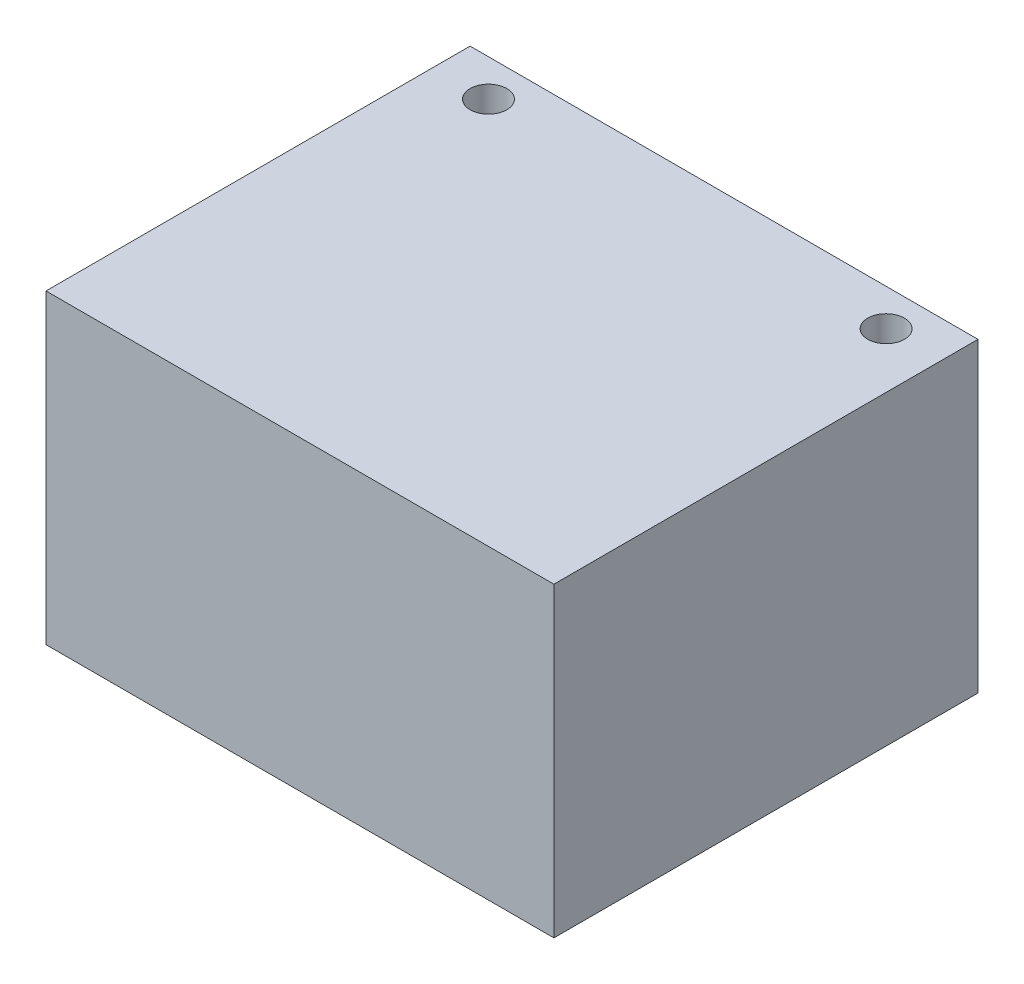
ISO-10303-21;
HEADER;
FILE_DESCRIPTION(('STEP AP214'),'2;1');
FILE_NAME('part.step','',(''),(''),'','','');
FILE_SCHEMA(('AUTOMOTIVE_DESIGN { 1 0 10303 214 1 1 1 1 }'));
ENDSEC;
DATA;
#1=APPLICATION_CONTEXT('core data for automotive mechanical design processes');
#2=APPLICATION_PROTOCOL_DEFINITION('international standard','automotive_design',2000,#1);
#3=PRODUCT_CONTEXT('',#1,'mechanical');
#4=PRODUCT('Part','Part','',(#3));
#5=PRODUCT_RELATED_PRODUCT_CATEGORY('part','',(#4));
#6=PRODUCT_DEFINITION_FORMATION('','',#4);
#7=PRODUCT_DEFINITION_CONTEXT('part definition',#1,'design');
#8=PRODUCT_DEFINITION('design','',#6,#7);
#9=PRODUCT_DEFINITION_SHAPE('','',#8);
#10=(LENGTH_UNIT() NAMED_UNIT(*) SI_UNIT(.MILLI.,.METRE.));
#11=(NAMED_UNIT(*) PLANE_ANGLE_UNIT() SI_UNIT($,.RADIAN.));
#12=(NAMED_UNIT(*) SI_UNIT($,.STERADIAN.) SOLID_ANGLE_UNIT());
#13=UNCERTAINTY_MEASURE_WITH_UNIT(LENGTH_MEASURE(1.E-05),#10,'distance_accuracy_value','');
#14=(GEOMETRIC_REPRESENTATION_CONTEXT(3) GLOBAL_UNCERTAINTY_ASSIGNED_CONTEXT((#13)) GLOBAL_UNIT_ASSIGNED_CONTEXT((#10,
#11,#12)) REPRESENTATION_CONTEXT('',''));
#15=CARTESIAN_POINT('',(0.,0.,0.));
#16=DIRECTION('',(0.,0.,1.));
#17=DIRECTION('',(1.,0.,0.));
#18=AXIS2_PLACEMENT_3D('',#15,#16,#17);
#19=CARTESIAN_POINT('',(20.725,25.,17.305));
#20=DIRECTION('',(-1.,0.,0.));
#21=DIRECTION('',(0.,0.,1.));
#22=AXIS2_PLACEMENT_3D('',#19,#20,#21);
#23=PLANE('',#22);
#24=DIRECTION('',(0.,0.,-1.));
#25=VECTOR('',#24,1.);
#26=CARTESIAN_POINT('',(20.725,0.,17.305));
#27=LINE('',#26,#25);
#28=CARTESIAN_POINT('',(20.725,0.,17.305));
#29=VERTEX_POINT('',#28);
#30=CARTESIAN_POINT('',(20.725,0.,-17.305));
#31=VERTEX_POINT('',#30);
#32=EDGE_CURVE('E113',#29,#31,#27,.T.);
#33=ORIENTED_EDGE('',*,*,#32,.T.);
#34=DIRECTION('',(0.,-1.,0.));
#35=VECTOR('',#34,1.);
#36=CARTESIAN_POINT('',(20.725,25.,-17.305));
#37=LINE('',#36,#35);
#38=CARTESIAN_POINT('',(20.725,25.,-17.305));
#39=VERTEX_POINT('',#38);
#40=EDGE_CURVE('E11',#39,#31,#37,.T.);
#41=ORIENTED_EDGE('',*,*,#40,.F.);
#42=DIRECTION('',(0.,0.,-1.));
#43=VECTOR('',#42,1.);
#44=CARTESIAN_POINT('',(20.725,25.,17.305));
#45=LINE('',#44,#43);
#46=CARTESIAN_POINT('',(20.725,25.,17.305));
#47=VERTEX_POINT('',#46);
#48=EDGE_CURVE('E97',#47,#39,#45,.T.);
#49=ORIENTED_EDGE('',*,*,#48,.F.);
#50=DIRECTION('',(0.,-1.,0.));
#51=VECTOR('',#50,1.);
#52=CARTESIAN_POINT('',(20.725,25.,17.305));
#53=LINE('',#52,#51);
#54=EDGE_CURVE('E109',#47,#29,#53,.T.);
#55=ORIENTED_EDGE('',*,*,#54,.T.);
#56=EDGE_LOOP('',(#33,#41,#49,#55));
#57=FACE_BOUND('',#56,.T.);
#58=ADVANCED_FACE('F45',(#57),#23,.F.);
#59=CARTESIAN_POINT('',(-20.725,25.,-17.305));
#60=DIRECTION('',(0.,0.,1.));
#61=DIRECTION('',(1.,0.,0.));
#62=AXIS2_PLACEMENT_3D('',#59,#60,#61);
#63=PLANE('',#62);
#64=DIRECTION('',(-1.,0.,0.));
#65=VECTOR('',#64,1.);
#66=CARTESIAN_POINT('',(-20.725,0.,-17.305));
#67=LINE('',#66,#65);
#68=CARTESIAN_POINT('',(-20.725,0.,-17.305));
#69=VERTEX_POINT('',#68);
#70=EDGE_CURVE('E102',#31,#69,#67,.T.);
#71=ORIENTED_EDGE('',*,*,#70,.T.);
#72=DIRECTION('',(0.,-1.,0.));
#73=VECTOR('',#72,1.);
#74=CARTESIAN_POINT('',(-20.725,25.,-17.305));
#75=LINE('',#74,#73);
#76=CARTESIAN_POINT('',(-20.725,25.,-17.305));
#77=VERTEX_POINT('',#76);
#78=EDGE_CURVE('E54',#77,#69,#75,.T.);
#79=ORIENTED_EDGE('',*,*,#78,.F.);
#80=DIRECTION('',(-1.,0.,0.));
#81=VECTOR('',#80,1.);
#82=CARTESIAN_POINT('',(-20.725,25.,-17.305));
#83=LINE('',#82,#81);
#84=EDGE_CURVE('E92',#39,#77,#83,.T.);
#85=ORIENTED_EDGE('',*,*,#84,.F.);
#86=ORIENTED_EDGE('',*,*,#40,.T.);
#87=EDGE_LOOP('',(#71,#79,#85,#86));
#88=FACE_BOUND('',#87,.T.);
#89=ADVANCED_FACE('F101',(#88),#63,.F.);
#90=CARTESIAN_POINT('',(-20.725,25.,17.305));
#91=DIRECTION('',(1.,0.,0.));
#92=DIRECTION('',(0.,0.,-1.));
#93=AXIS2_PLACEMENT_3D('',#90,#91,#92);
#94=PLANE('',#93);
#95=DIRECTION('',(0.,0.,1.));
#96=VECTOR('',#95,1.);
#97=CARTESIAN_POINT('',(-20.725,0.,17.305));
#98=LINE('',#97,#96);
#99=CARTESIAN_POINT('',(-20.725,0.,17.305));
#100=VERTEX_POINT('',#99);
#101=EDGE_CURVE('E79',#69,#100,#98,.T.);
#102=ORIENTED_EDGE('',*,*,#101,.T.);
#103=DIRECTION('',(0.,-1.,0.));
#104=VECTOR('',#103,1.);
#105=CARTESIAN_POINT('',(-20.725,25.,17.305));
#106=LINE('',#105,#104);
#107=CARTESIAN_POINT('',(-20.725,25.,17.305));
#108=VERTEX_POINT('',#107);
#109=EDGE_CURVE('E104',#108,#100,#106,.T.);
#110=ORIENTED_EDGE('',*,*,#109,.F.);
#111=DIRECTION('',(0.,0.,1.));
#112=VECTOR('',#111,1.);
#113=CARTESIAN_POINT('',(-20.725,25.,17.305));
#114=LINE('',#113,#112);
#115=EDGE_CURVE('E95',#77,#108,#114,.T.);
#116=ORIENTED_EDGE('',*,*,#115,.F.);
#117=ORIENTED_EDGE('',*,*,#78,.T.);
#118=EDGE_LOOP('',(#102,#110,#116,#117));
#119=FACE_BOUND('',#118,.T.);
#120=ADVANCED_FACE('F105',(#119),#94,.F.);
#121=CARTESIAN_POINT('',(-20.725,25.,17.305));
#122=DIRECTION('',(0.,0.,-1.));
#123=DIRECTION('',(-1.,0.,0.));
#124=AXIS2_PLACEMENT_3D('',#121,#122,#123);
#125=PLANE('',#124);
#126=DIRECTION('',(1.,0.,0.));
#127=VECTOR('',#126,1.);
#128=CARTESIAN_POINT('',(-20.725,0.,17.305));
#129=LINE('',#128,#127);
#130=EDGE_CURVE('E85',#100,#29,#129,.T.);
#131=ORIENTED_EDGE('',*,*,#130,.T.);
#132=ORIENTED_EDGE('',*,*,#54,.F.);
#133=DIRECTION('',(1.,0.,0.));
#134=VECTOR('',#133,1.);
#135=CARTESIAN_POINT('',(-20.725,25.,17.305));
#136=LINE('',#135,#134);
#137=EDGE_CURVE('E62',#108,#47,#136,.T.);
#138=ORIENTED_EDGE('',*,*,#137,.F.);
#139=ORIENTED_EDGE('',*,*,#109,.T.);
#140=EDGE_LOOP('',(#131,#132,#138,#139));
#141=FACE_BOUND('',#140,.T.);
#142=ADVANCED_FACE('F127',(#141),#125,.F.);
#143=CARTESIAN_POINT('',(0.,25.,0.));
#144=DIRECTION('',(0.,-1.,0.));
#145=DIRECTION('',(0.,0.,-1.));
#146=AXIS2_PLACEMENT_3D('',#143,#144,#145);
#147=PLANE('',#146);
#148=CARTESIAN_POINT('',(-16.225,25.,-14.305));
#149=DIRECTION('',(0.,1.,0.));
#150=DIRECTION('',(0.,0.,1.));
#151=AXIS2_PLACEMENT_3D('',#148,#149,#150);
#152=CIRCLE('',#151,1.5);
#153=CARTESIAN_POINT('',(-16.225,25.,-12.805));
#154=VERTEX_POINT('',#153);
#155=EDGE_CURVE('E142',#154,#154,#152,.T.);
#156=ORIENTED_EDGE('',*,*,#155,.F.);
#157=EDGE_LOOP('',(#156));
#158=FACE_BOUND('',#157,.T.);
#159=CARTESIAN_POINT('',(16.225,25.,-14.305));
#160=DIRECTION('',(0.,1.,0.));
#161=DIRECTION('',(0.,0.,1.));
#162=AXIS2_PLACEMENT_3D('',#159,#160,#161);
#163=CIRCLE('',#162,1.5);
#164=CARTESIAN_POINT('',(16.225,25.,-12.805));
#165=VERTEX_POINT('',#164);
#166=EDGE_CURVE('E138',#165,#165,#163,.T.);
#167=ORIENTED_EDGE('',*,*,#166,.F.);
#168=EDGE_LOOP('',(#167));
#169=FACE_BOUND('',#168,.T.);
#170=ORIENTED_EDGE('',*,*,#48,.T.);
#171=ORIENTED_EDGE('',*,*,#84,.T.);
#172=ORIENTED_EDGE('',*,*,#115,.T.);
#173=ORIENTED_EDGE('',*,*,#137,.T.);
#174=EDGE_LOOP('',(#170,#171,#172,#173));
#175=FACE_BOUND('',#174,.T.);
#176=ADVANCED_FACE('F93',(#158,#169,#175),#147,.F.);
#177=CARTESIAN_POINT('',(0.,0.,0.));
#178=DIRECTION('',(0.,-1.,0.));
#179=DIRECTION('',(0.,0.,-1.));
#180=AXIS2_PLACEMENT_3D('',#177,#178,#179);
#181=PLANE('',#180);
#182=CARTESIAN_POINT('',(-16.225,0.,-14.305));
#183=DIRECTION('',(0.,1.,0.));
#184=DIRECTION('',(0.,0.,1.));
#185=AXIS2_PLACEMENT_3D('',#182,#183,#184);
#186=CIRCLE('',#185,1.5);
#187=CARTESIAN_POINT('',(-16.225,0.,-12.805));
#188=VERTEX_POINT('',#187);
#189=EDGE_CURVE('E117',#188,#188,#186,.T.);
#190=ORIENTED_EDGE('',*,*,#189,.T.);
#191=EDGE_LOOP('',(#190));
#192=FACE_BOUND('',#191,.T.);
#193=CARTESIAN_POINT('',(16.225,0.,-14.305));
#194=DIRECTION('',(0.,1.,0.));
#195=DIRECTION('',(0.,0.,1.));
#196=AXIS2_PLACEMENT_3D('',#193,#194,#195);
#197=CIRCLE('',#196,1.5);
#198=CARTESIAN_POINT('',(16.225,0.,-12.805));
#199=VERTEX_POINT('',#198);
#200=EDGE_CURVE('E134',#199,#199,#197,.T.);
#201=ORIENTED_EDGE('',*,*,#200,.T.);
#202=EDGE_LOOP('',(#201));
#203=FACE_BOUND('',#202,.T.);
#204=ORIENTED_EDGE('',*,*,#32,.F.);
#205=ORIENTED_EDGE('',*,*,#130,.F.);
#206=ORIENTED_EDGE('',*,*,#101,.F.);
#207=ORIENTED_EDGE('',*,*,#70,.F.);
#208=EDGE_LOOP('',(#204,#205,#206,#207));
#209=FACE_BOUND('',#208,.T.);
#210=ADVANCED_FACE('F130',(#192,#203,#209),#181,.T.);
#211=CARTESIAN_POINT('',(16.225,0.,-14.305));
#212=DIRECTION('',(0.,1.,0.));
#213=DIRECTION('',(0.,0.,1.));
#214=AXIS2_PLACEMENT_3D('',#211,#212,#213);
#215=CYLINDRICAL_SURFACE('',#214,1.5);
#216=ORIENTED_EDGE('',*,*,#200,.F.);
#217=EDGE_LOOP('',(#216));
#218=FACE_BOUND('',#217,.T.);
#219=ORIENTED_EDGE('',*,*,#166,.T.);
#220=EDGE_LOOP('',(#219));
#221=FACE_BOUND('',#220,.T.);
#222=ADVANCED_FACE('F155',(#218,#221),#215,.F.);
#223=CARTESIAN_POINT('',(-16.225,0.,-14.305));
#224=DIRECTION('',(0.,1.,0.));
#225=DIRECTION('',(0.,0.,1.));
#226=AXIS2_PLACEMENT_3D('',#223,#224,#225);
#227=CYLINDRICAL_SURFACE('',#226,1.5);
#228=ORIENTED_EDGE('',*,*,#189,.F.);
#229=EDGE_LOOP('',(#228));
#230=FACE_BOUND('',#229,.T.);
#231=ORIENTED_EDGE('',*,*,#155,.T.);
#232=EDGE_LOOP('',(#231));
#233=FACE_BOUND('',#232,.T.);
#234=ADVANCED_FACE('F152',(#230,#233),#227,.F.);
#235=CLOSED_SHELL('',(#58,#89,#120,#142,#176,#210,#222,#234));
#236=MANIFOLD_SOLID_BREP('B2',#235);
#237=ADVANCED_BREP_SHAPE_REPRESENTATION('',(#18,#236),#14);
#238=SHAPE_DEFINITION_REPRESENTATION(#9,#237);
ENDSEC;
END-ISO-10303-21;
